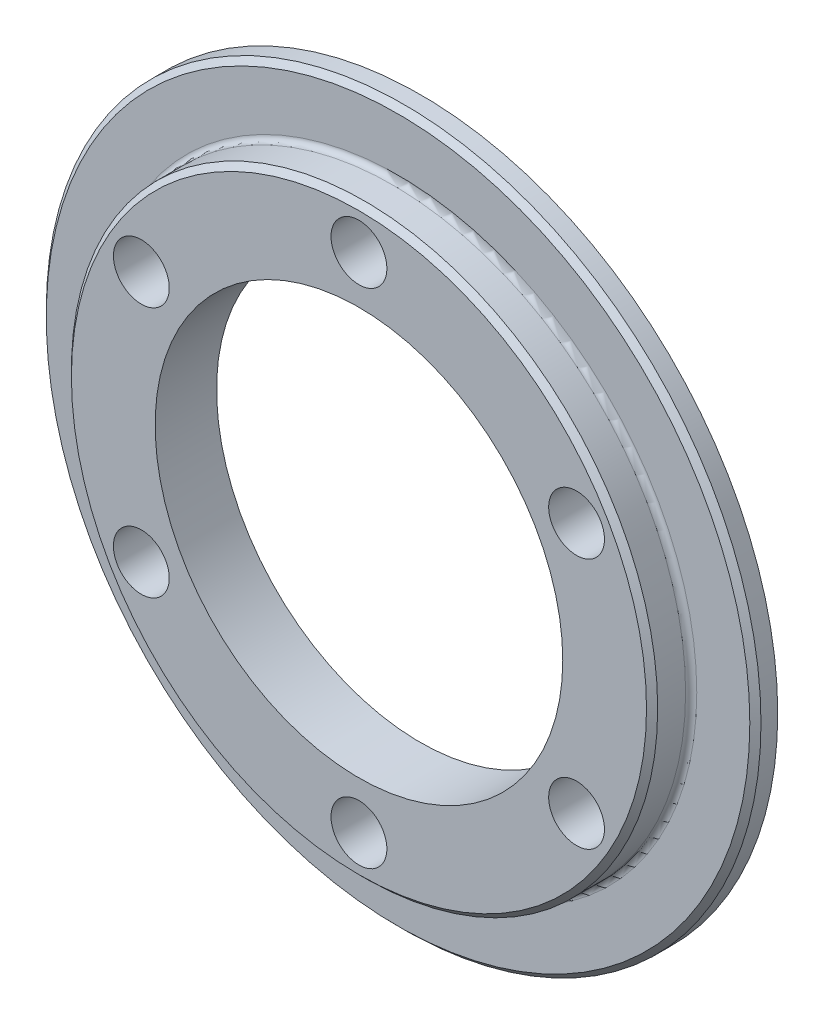
ISO-10303-21;
HEADER;
FILE_DESCRIPTION(('STEP AP214'),'2;1');
FILE_NAME('part.step','',(''),(''),'','','');
FILE_SCHEMA(('AUTOMOTIVE_DESIGN { 1 0 10303 214 1 1 1 1 }'));
ENDSEC;
DATA;
#1=APPLICATION_CONTEXT('core data for automotive mechanical design processes');
#2=APPLICATION_PROTOCOL_DEFINITION('international standard','automotive_design',2000,#1);
#3=PRODUCT_CONTEXT('',#1,'mechanical');
#4=PRODUCT('Part','Part','',(#3));
#5=PRODUCT_RELATED_PRODUCT_CATEGORY('part','',(#4));
#6=PRODUCT_DEFINITION_FORMATION('','',#4);
#7=PRODUCT_DEFINITION_CONTEXT('part definition',#1,'design');
#8=PRODUCT_DEFINITION('design','',#6,#7);
#9=PRODUCT_DEFINITION_SHAPE('','',#8);
#10=(LENGTH_UNIT() NAMED_UNIT(*) SI_UNIT(.MILLI.,.METRE.));
#11=(NAMED_UNIT(*) PLANE_ANGLE_UNIT() SI_UNIT($,.RADIAN.));
#12=(NAMED_UNIT(*) SI_UNIT($,.STERADIAN.) SOLID_ANGLE_UNIT());
#13=UNCERTAINTY_MEASURE_WITH_UNIT(LENGTH_MEASURE(1.E-05),#10,'distance_accuracy_value','');
#14=(GEOMETRIC_REPRESENTATION_CONTEXT(3) GLOBAL_UNCERTAINTY_ASSIGNED_CONTEXT((#13)) GLOBAL_UNIT_ASSIGNED_CONTEXT((#10,
#11,#12)) REPRESENTATION_CONTEXT('',''));
#15=CARTESIAN_POINT('',(0.,0.,0.));
#16=DIRECTION('',(0.,0.,1.));
#17=DIRECTION('',(1.,0.,0.));
#18=AXIS2_PLACEMENT_3D('',#15,#16,#17);
#19=CARTESIAN_POINT('',(0.,0.,11.));
#20=DIRECTION('',(0.,0.,1.));
#21=DIRECTION('',(1.,0.,0.));
#22=AXIS2_PLACEMENT_3D('',#19,#20,#21);
#23=PLANE('',#22);
#24=CARTESIAN_POINT('',(38.9711431702939,22.5000000000008,11.));
#25=DIRECTION('',(0.,0.,1.));
#26=DIRECTION('',(1.,0.,0.));
#27=AXIS2_PLACEMENT_3D('',#24,#25,#26);
#28=CIRCLE('',#27,4.99999999999839);
#29=CARTESIAN_POINT('',(33.9711431702955,22.5000000000008,11.));
#30=VERTEX_POINT('',#29);
#31=EDGE_CURVE('E105',#30,#30,#28,.T.);
#32=ORIENTED_EDGE('',*,*,#31,.F.);
#33=EDGE_LOOP('',(#32));
#34=FACE_BOUND('',#33,.T.);
#35=CARTESIAN_POINT('',(38.9711431702917,-22.4999999999937,11.));
#36=DIRECTION('',(0.,0.,1.));
#37=DIRECTION('',(1.,0.,0.));
#38=AXIS2_PLACEMENT_3D('',#35,#36,#37);
#39=CIRCLE('',#38,5.00000000000197);
#40=CARTESIAN_POINT('',(33.9711431702897,-22.4999999999937,11.));
#41=VERTEX_POINT('',#40);
#42=EDGE_CURVE('E96',#41,#41,#39,.T.);
#43=ORIENTED_EDGE('',*,*,#42,.F.);
#44=EDGE_LOOP('',(#43));
#45=FACE_BOUND('',#44,.T.);
#46=CARTESIAN_POINT('',(-4.40154306000749E-12,-44.999999999989,11.));
#47=DIRECTION('',(0.,0.,1.));
#48=DIRECTION('',(1.,0.,0.));
#49=AXIS2_PLACEMENT_3D('',#46,#47,#48);
#50=CIRCLE('',#49,5.00000000000772);
#51=CARTESIAN_POINT('',(-5.00000000001212,-44.999999999989,11.));
#52=VERTEX_POINT('',#51);
#53=EDGE_CURVE('E89',#52,#52,#50,.T.);
#54=ORIENTED_EDGE('',*,*,#53,.F.);
#55=EDGE_LOOP('',(#54));
#56=FACE_BOUND('',#55,.T.);
#57=CARTESIAN_POINT('',(-38.9711431702983,-22.4999999999898,11.));
#58=DIRECTION('',(0.,0.,1.));
#59=DIRECTION('',(1.,0.,0.));
#60=AXIS2_PLACEMENT_3D('',#57,#58,#59);
#61=CIRCLE('',#60,5.00000000000976);
#62=CARTESIAN_POINT('',(-43.971143170308,-22.4999999999898,11.));
#63=VERTEX_POINT('',#62);
#64=EDGE_CURVE('E85',#63,#63,#61,.T.);
#65=ORIENTED_EDGE('',*,*,#64,.F.);
#66=EDGE_LOOP('',(#65));
#67=FACE_BOUND('',#66,.T.);
#68=CARTESIAN_POINT('',(-38.9711431702961,22.5000000000047,11.));
#69=DIRECTION('',(0.,0.,1.));
#70=DIRECTION('',(1.,0.,0.));
#71=AXIS2_PLACEMENT_3D('',#68,#69,#70);
#72=CIRCLE('',#71,5.00000000000596);
#73=CARTESIAN_POINT('',(-43.971143170302,22.5000000000047,11.));
#74=VERTEX_POINT('',#73);
#75=EDGE_CURVE('E77',#74,#74,#72,.T.);
#76=ORIENTED_EDGE('',*,*,#75,.F.);
#77=EDGE_LOOP('',(#76));
#78=FACE_BOUND('',#77,.T.);
#79=CARTESIAN_POINT('',(0.,45.,11.));
#80=DIRECTION('',(0.,0.,1.));
#81=DIRECTION('',(1.,0.,0.));
#82=AXIS2_PLACEMENT_3D('',#79,#80,#81);
#83=CIRCLE('',#82,5.);
#84=CARTESIAN_POINT('',(-4.99999999999999,45.,11.));
#85=VERTEX_POINT('',#84);
#86=EDGE_CURVE('E67',#85,#85,#83,.T.);
#87=ORIENTED_EDGE('',*,*,#86,.F.);
#88=EDGE_LOOP('',(#87));
#89=FACE_BOUND('',#88,.T.);
#90=CARTESIAN_POINT('',(0.,0.,11.));
#91=DIRECTION('',(0.,0.,1.));
#92=DIRECTION('',(1.,0.,0.));
#93=AXIS2_PLACEMENT_3D('',#90,#91,#92);
#94=CIRCLE('',#93,51.5);
#95=CARTESIAN_POINT('',(51.5,0.,11.));
#96=VERTEX_POINT('',#95);
#97=EDGE_CURVE('E42',#96,#96,#94,.T.);
#98=ORIENTED_EDGE('',*,*,#97,.T.);
#99=EDGE_LOOP('',(#98));
#100=FACE_BOUND('',#99,.T.);
#101=CARTESIAN_POINT('',(0.,0.,11.));
#102=DIRECTION('',(0.,0.,1.));
#103=DIRECTION('',(1.,0.,0.));
#104=AXIS2_PLACEMENT_3D('',#101,#102,#103);
#105=CIRCLE('',#104,36.5);
#106=CARTESIAN_POINT('',(36.5,0.,11.));
#107=VERTEX_POINT('',#106);
#108=EDGE_CURVE('E68',#107,#107,#105,.T.);
#109=ORIENTED_EDGE('',*,*,#108,.F.);
#110=EDGE_LOOP('',(#109));
#111=FACE_BOUND('',#110,.T.);
#112=ADVANCED_FACE('F40',(#34,#45,#56,#67,#78,#89,#100,#111),#23,.T.);
#113=CARTESIAN_POINT('',(0.,0.,11.));
#114=DIRECTION('',(0.,0.,-1.));
#115=DIRECTION('',(-1.,0.,0.));
#116=AXIS2_PLACEMENT_3D('',#113,#114,#115);
#117=CYLINDRICAL_SURFACE('',#116,64.);
#118=CARTESIAN_POINT('',(0.,0.,3.00000000000005));
#119=DIRECTION('',(0.,0.,1.));
#120=DIRECTION('',(1.,0.,0.));
#121=AXIS2_PLACEMENT_3D('',#118,#119,#120);
#122=CIRCLE('',#121,64.);
#123=CARTESIAN_POINT('',(64.,0.,3.00000000000005));
#124=VERTEX_POINT('',#123);
#125=EDGE_CURVE('E48',#124,#124,#122,.F.);
#126=ORIENTED_EDGE('',*,*,#125,.T.);
#127=EDGE_LOOP('',(#126));
#128=FACE_BOUND('',#127,.T.);
#129=CARTESIAN_POINT('',(0.,0.,0.));
#130=DIRECTION('',(0.,0.,1.));
#131=DIRECTION('',(1.,0.,0.));
#132=AXIS2_PLACEMENT_3D('',#129,#130,#131);
#133=CIRCLE('',#132,64.);
#134=CARTESIAN_POINT('',(64.,0.,0.));
#135=VERTEX_POINT('',#134);
#136=EDGE_CURVE('E62',#135,#135,#133,.T.);
#137=ORIENTED_EDGE('',*,*,#136,.T.);
#138=EDGE_LOOP('',(#137));
#139=FACE_BOUND('',#138,.T.);
#140=ADVANCED_FACE('F113',(#128,#139),#117,.T.);
#141=CARTESIAN_POINT('',(0.,0.,0.));
#142=DIRECTION('',(0.,0.,1.));
#143=DIRECTION('',(1.,0.,0.));
#144=AXIS2_PLACEMENT_3D('',#141,#142,#143);
#145=PLANE('',#144);
#146=CARTESIAN_POINT('',(38.9711431702939,22.5000000000008,0.));
#147=DIRECTION('',(0.,0.,-1.));
#148=DIRECTION('',(-1.,0.,0.));
#149=AXIS2_PLACEMENT_3D('',#146,#147,#148);
#150=CIRCLE('',#149,4.99999999999839);
#151=CARTESIAN_POINT('',(33.9711431702955,22.5000000000008,0.));
#152=VERTEX_POINT('',#151);
#153=EDGE_CURVE('E104',#152,#152,#150,.T.);
#154=ORIENTED_EDGE('',*,*,#153,.F.);
#155=EDGE_LOOP('',(#154));
#156=FACE_BOUND('',#155,.T.);
#157=CARTESIAN_POINT('',(38.9711431702917,-22.4999999999937,0.));
#158=DIRECTION('',(0.,0.,-1.));
#159=DIRECTION('',(-1.,0.,0.));
#160=AXIS2_PLACEMENT_3D('',#157,#158,#159);
#161=CIRCLE('',#160,5.00000000000197);
#162=CARTESIAN_POINT('',(33.9711431702897,-22.4999999999937,0.));
#163=VERTEX_POINT('',#162);
#164=EDGE_CURVE('E97',#163,#163,#161,.T.);
#165=ORIENTED_EDGE('',*,*,#164,.F.);
#166=EDGE_LOOP('',(#165));
#167=FACE_BOUND('',#166,.T.);
#168=CARTESIAN_POINT('',(-4.40154306000749E-12,-44.999999999989,0.));
#169=DIRECTION('',(0.,0.,-1.));
#170=DIRECTION('',(-1.,0.,0.));
#171=AXIS2_PLACEMENT_3D('',#168,#169,#170);
#172=CIRCLE('',#171,5.00000000000772);
#173=CARTESIAN_POINT('',(-5.00000000001212,-44.999999999989,0.));
#174=VERTEX_POINT('',#173);
#175=EDGE_CURVE('E91',#174,#174,#172,.T.);
#176=ORIENTED_EDGE('',*,*,#175,.F.);
#177=EDGE_LOOP('',(#176));
#178=FACE_BOUND('',#177,.T.);
#179=CARTESIAN_POINT('',(-38.9711431702983,-22.4999999999898,0.));
#180=DIRECTION('',(0.,0.,-1.));
#181=DIRECTION('',(-1.,0.,0.));
#182=AXIS2_PLACEMENT_3D('',#179,#180,#181);
#183=CIRCLE('',#182,5.00000000000976);
#184=CARTESIAN_POINT('',(-43.971143170308,-22.4999999999898,0.));
#185=VERTEX_POINT('',#184);
#186=EDGE_CURVE('E87',#185,#185,#183,.T.);
#187=ORIENTED_EDGE('',*,*,#186,.F.);
#188=EDGE_LOOP('',(#187));
#189=FACE_BOUND('',#188,.T.);
#190=CARTESIAN_POINT('',(-38.9711431702961,22.5000000000047,0.));
#191=DIRECTION('',(0.,0.,-1.));
#192=DIRECTION('',(-1.,0.,0.));
#193=AXIS2_PLACEMENT_3D('',#190,#191,#192);
#194=CIRCLE('',#193,5.00000000000596);
#195=CARTESIAN_POINT('',(-43.971143170302,22.5000000000047,0.));
#196=VERTEX_POINT('',#195);
#197=EDGE_CURVE('E83',#196,#196,#194,.T.);
#198=ORIENTED_EDGE('',*,*,#197,.F.);
#199=EDGE_LOOP('',(#198));
#200=FACE_BOUND('',#199,.T.);
#201=CARTESIAN_POINT('',(0.,45.,0.));
#202=DIRECTION('',(0.,0.,-1.));
#203=DIRECTION('',(-1.,0.,0.));
#204=AXIS2_PLACEMENT_3D('',#201,#202,#203);
#205=CIRCLE('',#204,5.);
#206=CARTESIAN_POINT('',(-4.99999999999999,45.,0.));
#207=VERTEX_POINT('',#206);
#208=EDGE_CURVE('E73',#207,#207,#205,.T.);
#209=ORIENTED_EDGE('',*,*,#208,.F.);
#210=EDGE_LOOP('',(#209));
#211=FACE_BOUND('',#210,.T.);
#212=ORIENTED_EDGE('',*,*,#136,.F.);
#213=EDGE_LOOP('',(#212));
#214=FACE_BOUND('',#213,.T.);
#215=CARTESIAN_POINT('',(0.,0.,0.));
#216=DIRECTION('',(0.,0.,1.));
#217=DIRECTION('',(1.,0.,0.));
#218=AXIS2_PLACEMENT_3D('',#215,#216,#217);
#219=CIRCLE('',#218,36.5);
#220=CARTESIAN_POINT('',(36.5,0.,0.));
#221=VERTEX_POINT('',#220);
#222=EDGE_CURVE('E70',#221,#221,#219,.T.);
#223=ORIENTED_EDGE('',*,*,#222,.T.);
#224=EDGE_LOOP('',(#223));
#225=FACE_BOUND('',#224,.T.);
#226=ADVANCED_FACE('F112',(#156,#167,#178,#189,#200,#211,#214,#225),#145,.F.);
#227=CARTESIAN_POINT('',(0.,0.,11.));
#228=DIRECTION('',(0.,0.,-1.));
#229=DIRECTION('',(-1.,0.,0.));
#230=AXIS2_PLACEMENT_3D('',#227,#228,#229);
#231=CYLINDRICAL_SURFACE('',#230,36.5);
#232=ORIENTED_EDGE('',*,*,#108,.T.);
#233=EDGE_LOOP('',(#232));
#234=FACE_BOUND('',#233,.T.);
#235=ORIENTED_EDGE('',*,*,#222,.F.);
#236=EDGE_LOOP('',(#235));
#237=FACE_BOUND('',#236,.T.);
#238=ADVANCED_FACE('F111',(#234,#237),#231,.F.);
#239=CARTESIAN_POINT('',(0.,0.,4.));
#240=DIRECTION('',(0.,0.,1.));
#241=DIRECTION('',(1.,0.,0.));
#242=AXIS2_PLACEMENT_3D('',#239,#240,#241);
#243=PLANE('',#242);
#244=CARTESIAN_POINT('',(0.,0.,4.));
#245=DIRECTION('',(0.,0.,1.));
#246=DIRECTION('',(1.,0.,0.));
#247=AXIS2_PLACEMENT_3D('',#244,#245,#246);
#248=CIRCLE('',#247,63.0000000000001);
#249=CARTESIAN_POINT('',(63.0000000000001,0.,4.));
#250=VERTEX_POINT('',#249);
#251=EDGE_CURVE('E55',#250,#250,#248,.T.);
#252=ORIENTED_EDGE('',*,*,#251,.T.);
#253=EDGE_LOOP('',(#252));
#254=FACE_BOUND('',#253,.T.);
#255=CARTESIAN_POINT('',(0.,0.,4.));
#256=DIRECTION('',(0.,0.,1.));
#257=DIRECTION('',(1.,0.,0.));
#258=AXIS2_PLACEMENT_3D('',#255,#256,#257);
#259=CIRCLE('',#258,53.5);
#260=CARTESIAN_POINT('',(53.5,0.,4.));
#261=VERTEX_POINT('',#260);
#262=EDGE_CURVE('E60',#261,#261,#259,.F.);
#263=ORIENTED_EDGE('',*,*,#262,.T.);
#264=EDGE_LOOP('',(#263));
#265=FACE_BOUND('',#264,.T.);
#266=ADVANCED_FACE('F135',(#254,#265),#243,.T.);
#267=CARTESIAN_POINT('',(0.,0.,4.));
#268=DIRECTION('',(0.,0.,1.));
#269=DIRECTION('',(1.,0.,0.));
#270=AXIS2_PLACEMENT_3D('',#267,#268,#269);
#271=CYLINDRICAL_SURFACE('',#270,52.5);
#272=CARTESIAN_POINT('',(0.,0.,9.99999999999998));
#273=DIRECTION('',(0.,0.,1.));
#274=DIRECTION('',(1.,0.,0.));
#275=AXIS2_PLACEMENT_3D('',#272,#273,#274);
#276=CIRCLE('',#275,52.5);
#277=CARTESIAN_POINT('',(52.5,0.,9.99999999999998));
#278=VERTEX_POINT('',#277);
#279=EDGE_CURVE('E10',#278,#278,#276,.F.);
#280=ORIENTED_EDGE('',*,*,#279,.T.);
#281=EDGE_LOOP('',(#280));
#282=FACE_BOUND('',#281,.T.);
#283=CARTESIAN_POINT('',(0.,0.,5.));
#284=DIRECTION('',(0.,0.,1.));
#285=DIRECTION('',(1.,0.,0.));
#286=AXIS2_PLACEMENT_3D('',#283,#284,#285);
#287=CIRCLE('',#286,52.5);
#288=CARTESIAN_POINT('',(52.5,0.,5.));
#289=VERTEX_POINT('',#288);
#290=EDGE_CURVE('E58',#289,#289,#287,.T.);
#291=ORIENTED_EDGE('',*,*,#290,.T.);
#292=EDGE_LOOP('',(#291));
#293=FACE_BOUND('',#292,.T.);
#294=ADVANCED_FACE('F140',(#282,#293),#271,.T.);
#295=CARTESIAN_POINT('',(0.,0.,5.));
#296=DIRECTION('',(0.,0.,1.));
#297=DIRECTION('',(1.,0.,0.));
#298=AXIS2_PLACEMENT_3D('',#295,#296,#297);
#299=TOROIDAL_SURFACE('',#298,53.5,1.);
#300=ORIENTED_EDGE('',*,*,#262,.F.);
#301=EDGE_LOOP('',(#300));
#302=FACE_BOUND('',#301,.T.);
#303=ORIENTED_EDGE('',*,*,#290,.F.);
#304=EDGE_LOOP('',(#303));
#305=FACE_BOUND('',#304,.T.);
#306=ADVANCED_FACE('F152',(#302,#305),#299,.F.);
#307=CARTESIAN_POINT('',(0.,0.,4.));
#308=DIRECTION('',(0.,0.,-1.));
#309=DIRECTION('',(-1.,0.,0.));
#310=AXIS2_PLACEMENT_3D('',#307,#308,#309);
#311=CONICAL_SURFACE('',#310,63.0000000000001,0.785398163397449);
#312=ORIENTED_EDGE('',*,*,#125,.F.);
#313=EDGE_LOOP('',(#312));
#314=FACE_BOUND('',#313,.T.);
#315=ORIENTED_EDGE('',*,*,#251,.F.);
#316=EDGE_LOOP('',(#315));
#317=FACE_BOUND('',#316,.T.);
#318=ADVANCED_FACE('F154',(#314,#317),#311,.T.);
#319=CARTESIAN_POINT('',(0.,0.,11.));
#320=DIRECTION('',(0.,0.,-1.));
#321=DIRECTION('',(-1.,0.,0.));
#322=AXIS2_PLACEMENT_3D('',#319,#320,#321);
#323=CONICAL_SURFACE('',#322,51.5,0.785398163397441);
#324=ORIENTED_EDGE('',*,*,#279,.F.);
#325=EDGE_LOOP('',(#324));
#326=FACE_BOUND('',#325,.T.);
#327=ORIENTED_EDGE('',*,*,#97,.F.);
#328=EDGE_LOOP('',(#327));
#329=FACE_BOUND('',#328,.T.);
#330=ADVANCED_FACE('F39',(#326,#329),#323,.T.);
#331=CARTESIAN_POINT('',(0.,45.,60.));
#332=DIRECTION('',(0.,0.,-1.));
#333=DIRECTION('',(-1.,0.,0.));
#334=AXIS2_PLACEMENT_3D('',#331,#332,#333);
#335=CYLINDRICAL_SURFACE('',#334,5.);
#336=CARTESIAN_POINT('',(-4.99999999999999,45.,11.));
#337=CARTESIAN_POINT('',(-4.99999999999999,45.,10.8854166666667));
#338=CARTESIAN_POINT('',(-4.99999999999999,45.,10.7708333333333));
#339=CARTESIAN_POINT('',(-4.99999999999999,45.,10.5416666666667));
#340=CARTESIAN_POINT('',(-4.99999999999999,45.,10.4270833333333));
#341=CARTESIAN_POINT('',(-4.99999999999999,45.,10.1979166666667));
#342=CARTESIAN_POINT('',(-4.99999999999999,45.,10.0833333333333));
#343=CARTESIAN_POINT('',(-4.99999999999999,45.,9.85416666666666));
#344=CARTESIAN_POINT('',(-4.99999999999999,45.,9.73958333333333));
#345=CARTESIAN_POINT('',(-4.99999999999999,45.,9.51041666666666));
#346=CARTESIAN_POINT('',(-4.99999999999999,45.,9.39583333333333));
#347=CARTESIAN_POINT('',(-4.99999999999999,45.,9.16666666666666));
#348=CARTESIAN_POINT('',(-4.99999999999999,45.,9.05208333333333));
#349=CARTESIAN_POINT('',(-4.99999999999999,45.,8.82291666666666));
#350=CARTESIAN_POINT('',(-4.99999999999999,45.,8.70833333333333));
#351=CARTESIAN_POINT('',(-4.99999999999999,45.,8.47916666666666));
#352=CARTESIAN_POINT('',(-4.99999999999999,45.,8.36458333333333));
#353=CARTESIAN_POINT('',(-4.99999999999999,45.,8.13541666666666));
#354=CARTESIAN_POINT('',(-4.99999999999999,45.,8.02083333333333));
#355=CARTESIAN_POINT('',(-4.99999999999999,45.,7.79166666666666));
#356=CARTESIAN_POINT('',(-4.99999999999999,45.,7.67708333333333));
#357=CARTESIAN_POINT('',(-4.99999999999999,45.,7.44791666666667));
#358=CARTESIAN_POINT('',(-4.99999999999999,45.,7.33333333333333));
#359=CARTESIAN_POINT('',(-4.99999999999999,45.,7.10416666666666));
#360=CARTESIAN_POINT('',(-4.99999999999999,45.,6.98958333333333));
#361=CARTESIAN_POINT('',(-4.99999999999999,45.,6.76041666666666));
#362=CARTESIAN_POINT('',(-4.99999999999999,45.,6.64583333333333));
#363=CARTESIAN_POINT('',(-4.99999999999999,45.,6.41666666666666));
#364=CARTESIAN_POINT('',(-4.99999999999999,45.,6.30208333333333));
#365=CARTESIAN_POINT('',(-4.99999999999999,45.,6.07291666666666));
#366=CARTESIAN_POINT('',(-4.99999999999999,45.,5.95833333333333));
#367=CARTESIAN_POINT('',(-4.99999999999999,45.,5.72916666666666));
#368=CARTESIAN_POINT('',(-4.99999999999999,45.,5.61458333333333));
#369=CARTESIAN_POINT('',(-4.99999999999999,45.,5.38541666666667));
#370=CARTESIAN_POINT('',(-4.99999999999999,45.,5.27083333333333));
#371=CARTESIAN_POINT('',(-4.99999999999999,45.,5.04166666666667));
#372=CARTESIAN_POINT('',(-4.99999999999999,45.,4.92708333333333));
#373=CARTESIAN_POINT('',(-4.99999999999999,45.,4.69791666666667));
#374=CARTESIAN_POINT('',(-4.99999999999999,45.,4.58333333333333));
#375=CARTESIAN_POINT('',(-4.99999999999999,45.,4.35416666666667));
#376=CARTESIAN_POINT('',(-4.99999999999999,45.,4.23958333333333));
#377=CARTESIAN_POINT('',(-4.99999999999999,45.,4.01041666666666));
#378=CARTESIAN_POINT('',(-4.99999999999999,45.,3.89583333333333));
#379=CARTESIAN_POINT('',(-4.99999999999999,45.,3.66666666666667));
#380=CARTESIAN_POINT('',(-4.99999999999999,45.,3.55208333333333));
#381=CARTESIAN_POINT('',(-4.99999999999999,45.,3.32291666666666));
#382=CARTESIAN_POINT('',(-4.99999999999999,45.,3.20833333333333));
#383=CARTESIAN_POINT('',(-4.99999999999999,45.,2.97916666666667));
#384=CARTESIAN_POINT('',(-4.99999999999999,45.,2.86458333333333));
#385=CARTESIAN_POINT('',(-4.99999999999999,45.,2.63541666666667));
#386=CARTESIAN_POINT('',(-4.99999999999999,45.,2.52083333333333));
#387=CARTESIAN_POINT('',(-4.99999999999999,45.,2.29166666666666));
#388=CARTESIAN_POINT('',(-4.99999999999999,45.,2.17708333333333));
#389=CARTESIAN_POINT('',(-4.99999999999999,45.,1.94791666666666));
#390=CARTESIAN_POINT('',(-4.99999999999999,45.,1.83333333333333));
#391=CARTESIAN_POINT('',(-4.99999999999999,45.,1.60416666666667));
#392=CARTESIAN_POINT('',(-4.99999999999999,45.,1.48958333333333));
#393=CARTESIAN_POINT('',(-4.99999999999999,45.,1.26041666666667));
#394=CARTESIAN_POINT('',(-4.99999999999999,45.,1.14583333333333));
#395=CARTESIAN_POINT('',(-4.99999999999999,45.,0.916666666666665));
#396=CARTESIAN_POINT('',(-4.99999999999999,45.,0.802083333333333));
#397=CARTESIAN_POINT('',(-4.99999999999999,45.,0.572916666666668));
#398=CARTESIAN_POINT('',(-4.99999999999999,45.,0.458333333333336));
#399=CARTESIAN_POINT('',(-4.99999999999999,45.,0.229166666666669));
#400=CARTESIAN_POINT('',(-4.99999999999999,45.,0.114583333333335));
#401=CARTESIAN_POINT('',(-4.99999999999999,45.,0.));
#402=B_SPLINE_CURVE_WITH_KNOTS('',3,(#336,#337,#338,#339,#340,#341,#342,#343,#344,#345,#346,
#347,#348,#349,#350,#351,#352,#353,#354,#355,#356,#357,#358,#359,#360,#361,#362,#363,#364,#365,
#366,#367,#368,#369,#370,#371,#372,#373,#374,#375,#376,#377,#378,#379,#380,#381,#382,#383,#384,
#385,#386,#387,#388,#389,#390,#391,#392,#393,#394,#395,#396,#397,#398,#399,#400,#401),
.UNSPECIFIED.,.F.,.F.,(4,2,2,2,2,2,2,2,2,2,2,2,2,2,2,2,2,2,2,2,2,2,2,2,2,2,2,2,2,2,2,2,4),(0.,
0.343749999999997,0.687500000000001,1.03125,1.375,1.71875,2.0625,2.40625,2.75,3.09375,3.4375,
3.78125,4.125,4.46875,4.8125,5.15625,5.5,5.84374999999999,6.1875,6.53125,6.875,7.21875,7.5625,
7.90625,8.24999999999999,8.59375,8.9375,9.28125,9.62499999999999,9.96875,10.3125,10.65625,11.),.UNSPECIFIED.);
#403=EDGE_CURVE('BSEAM165',#85,#207,#402,.T.);
#404=ORIENTED_EDGE('',*,*,#86,.T.);
#405=ORIENTED_EDGE('',*,*,#208,.T.);
#406=ORIENTED_EDGE('',*,*,#403,.T.);
#407=ORIENTED_EDGE('',*,*,#403,.F.);
#408=EDGE_LOOP('',(#404,#406,#405,#407));
#409=FACE_BOUND('',#408,.T.);
#410=ADVANCED_FACE('F165',(#409),#335,.F.);
#411=CARTESIAN_POINT('',(-38.9711431702961,22.5000000000047,60.));
#412=DIRECTION('',(0.,0.,-1.));
#413=DIRECTION('',(-1.,0.,0.));
#414=AXIS2_PLACEMENT_3D('',#411,#412,#413);
#415=CYLINDRICAL_SURFACE('',#414,5.00000000000596);
#416=CARTESIAN_POINT('',(-43.971143170302,22.5000000000047,11.));
#417=CARTESIAN_POINT('',(-43.971143170302,22.5000000000047,10.8854166666667));
#418=CARTESIAN_POINT('',(-43.971143170302,22.5000000000047,10.7708333333333));
#419=CARTESIAN_POINT('',(-43.971143170302,22.5000000000047,10.5416666666667));
#420=CARTESIAN_POINT('',(-43.971143170302,22.5000000000047,10.4270833333333));
#421=CARTESIAN_POINT('',(-43.971143170302,22.5000000000047,10.1979166666667));
#422=CARTESIAN_POINT('',(-43.971143170302,22.5000000000047,10.0833333333333));
#423=CARTESIAN_POINT('',(-43.971143170302,22.5000000000047,9.85416666666666));
#424=CARTESIAN_POINT('',(-43.971143170302,22.5000000000047,9.73958333333333));
#425=CARTESIAN_POINT('',(-43.971143170302,22.5000000000047,9.51041666666666));
#426=CARTESIAN_POINT('',(-43.971143170302,22.5000000000047,9.39583333333333));
#427=CARTESIAN_POINT('',(-43.971143170302,22.5000000000047,9.16666666666666));
#428=CARTESIAN_POINT('',(-43.971143170302,22.5000000000047,9.05208333333333));
#429=CARTESIAN_POINT('',(-43.971143170302,22.5000000000047,8.82291666666666));
#430=CARTESIAN_POINT('',(-43.971143170302,22.5000000000047,8.70833333333333));
#431=CARTESIAN_POINT('',(-43.971143170302,22.5000000000047,8.47916666666666));
#432=CARTESIAN_POINT('',(-43.971143170302,22.5000000000047,8.36458333333333));
#433=CARTESIAN_POINT('',(-43.971143170302,22.5000000000047,8.13541666666666));
#434=CARTESIAN_POINT('',(-43.971143170302,22.5000000000047,8.02083333333333));
#435=CARTESIAN_POINT('',(-43.971143170302,22.5000000000047,7.79166666666666));
#436=CARTESIAN_POINT('',(-43.971143170302,22.5000000000047,7.67708333333333));
#437=CARTESIAN_POINT('',(-43.971143170302,22.5000000000047,7.44791666666667));
#438=CARTESIAN_POINT('',(-43.971143170302,22.5000000000047,7.33333333333333));
#439=CARTESIAN_POINT('',(-43.971143170302,22.5000000000047,7.10416666666666));
#440=CARTESIAN_POINT('',(-43.971143170302,22.5000000000047,6.98958333333333));
#441=CARTESIAN_POINT('',(-43.971143170302,22.5000000000047,6.76041666666666));
#442=CARTESIAN_POINT('',(-43.971143170302,22.5000000000047,6.64583333333333));
#443=CARTESIAN_POINT('',(-43.971143170302,22.5000000000047,6.41666666666666));
#444=CARTESIAN_POINT('',(-43.971143170302,22.5000000000047,6.30208333333333));
#445=CARTESIAN_POINT('',(-43.971143170302,22.5000000000047,6.07291666666666));
#446=CARTESIAN_POINT('',(-43.971143170302,22.5000000000047,5.95833333333333));
#447=CARTESIAN_POINT('',(-43.971143170302,22.5000000000047,5.72916666666666));
#448=CARTESIAN_POINT('',(-43.971143170302,22.5000000000047,5.61458333333333));
#449=CARTESIAN_POINT('',(-43.971143170302,22.5000000000047,5.38541666666667));
#450=CARTESIAN_POINT('',(-43.971143170302,22.5000000000047,5.27083333333333));
#451=CARTESIAN_POINT('',(-43.971143170302,22.5000000000047,5.04166666666667));
#452=CARTESIAN_POINT('',(-43.971143170302,22.5000000000047,4.92708333333333));
#453=CARTESIAN_POINT('',(-43.971143170302,22.5000000000047,4.69791666666667));
#454=CARTESIAN_POINT('',(-43.971143170302,22.5000000000047,4.58333333333333));
#455=CARTESIAN_POINT('',(-43.971143170302,22.5000000000047,4.35416666666667));
#456=CARTESIAN_POINT('',(-43.971143170302,22.5000000000047,4.23958333333333));
#457=CARTESIAN_POINT('',(-43.971143170302,22.5000000000047,4.01041666666666));
#458=CARTESIAN_POINT('',(-43.971143170302,22.5000000000047,3.89583333333333));
#459=CARTESIAN_POINT('',(-43.971143170302,22.5000000000047,3.66666666666667));
#460=CARTESIAN_POINT('',(-43.971143170302,22.5000000000047,3.55208333333333));
#461=CARTESIAN_POINT('',(-43.971143170302,22.5000000000047,3.32291666666666));
#462=CARTESIAN_POINT('',(-43.971143170302,22.5000000000047,3.20833333333333));
#463=CARTESIAN_POINT('',(-43.971143170302,22.5000000000047,2.97916666666667));
#464=CARTESIAN_POINT('',(-43.971143170302,22.5000000000047,2.86458333333333));
#465=CARTESIAN_POINT('',(-43.971143170302,22.5000000000047,2.63541666666667));
#466=CARTESIAN_POINT('',(-43.971143170302,22.5000000000047,2.52083333333333));
#467=CARTESIAN_POINT('',(-43.971143170302,22.5000000000047,2.29166666666666));
#468=CARTESIAN_POINT('',(-43.971143170302,22.5000000000047,2.17708333333333));
#469=CARTESIAN_POINT('',(-43.971143170302,22.5000000000047,1.94791666666666));
#470=CARTESIAN_POINT('',(-43.971143170302,22.5000000000047,1.83333333333333));
#471=CARTESIAN_POINT('',(-43.971143170302,22.5000000000047,1.60416666666667));
#472=CARTESIAN_POINT('',(-43.971143170302,22.5000000000047,1.48958333333333));
#473=CARTESIAN_POINT('',(-43.971143170302,22.5000000000047,1.26041666666667));
#474=CARTESIAN_POINT('',(-43.971143170302,22.5000000000047,1.14583333333333));
#475=CARTESIAN_POINT('',(-43.971143170302,22.5000000000047,0.916666666666665));
#476=CARTESIAN_POINT('',(-43.971143170302,22.5000000000047,0.802083333333333));
#477=CARTESIAN_POINT('',(-43.971143170302,22.5000000000047,0.572916666666668));
#478=CARTESIAN_POINT('',(-43.971143170302,22.5000000000047,0.458333333333336));
#479=CARTESIAN_POINT('',(-43.971143170302,22.5000000000047,0.229166666666669));
#480=CARTESIAN_POINT('',(-43.971143170302,22.5000000000047,0.114583333333335));
#481=CARTESIAN_POINT('',(-43.971143170302,22.5000000000047,0.));
#482=B_SPLINE_CURVE_WITH_KNOTS('',3,(#416,#417,#418,#419,#420,#421,#422,#423,#424,#425,#426,
#427,#428,#429,#430,#431,#432,#433,#434,#435,#436,#437,#438,#439,#440,#441,#442,#443,#444,#445,
#446,#447,#448,#449,#450,#451,#452,#453,#454,#455,#456,#457,#458,#459,#460,#461,#462,#463,#464,
#465,#466,#467,#468,#469,#470,#471,#472,#473,#474,#475,#476,#477,#478,#479,#480,#481),
.UNSPECIFIED.,.F.,.F.,(4,2,2,2,2,2,2,2,2,2,2,2,2,2,2,2,2,2,2,2,2,2,2,2,2,2,2,2,2,2,2,2,4),(0.,
0.343749999999997,0.687500000000001,1.03125,1.375,1.71875,2.0625,2.40625,2.75,3.09375,3.4375,
3.78125,4.125,4.46875,4.8125,5.15625,5.5,5.84374999999999,6.1875,6.53125,6.875,7.21875,7.5625,
7.90625,8.24999999999999,8.59375,8.9375,9.28125,9.62499999999999,9.96875,10.3125,10.65625,11.),.UNSPECIFIED.);
#483=EDGE_CURVE('BSEAM176',#74,#196,#482,.T.);
#484=ORIENTED_EDGE('',*,*,#75,.T.);
#485=ORIENTED_EDGE('',*,*,#197,.T.);
#486=ORIENTED_EDGE('',*,*,#483,.T.);
#487=ORIENTED_EDGE('',*,*,#483,.F.);
#488=EDGE_LOOP('',(#484,#486,#485,#487));
#489=FACE_BOUND('',#488,.T.);
#490=ADVANCED_FACE('F176',(#489),#415,.F.);
#491=CARTESIAN_POINT('',(-38.9711431702983,-22.4999999999898,60.));
#492=DIRECTION('',(0.,0.,-1.));
#493=DIRECTION('',(-1.,0.,0.));
#494=AXIS2_PLACEMENT_3D('',#491,#492,#493);
#495=CYLINDRICAL_SURFACE('',#494,5.00000000000976);
#496=CARTESIAN_POINT('',(-43.971143170308,-22.4999999999898,11.));
#497=CARTESIAN_POINT('',(-43.971143170308,-22.4999999999898,10.8854166666667));
#498=CARTESIAN_POINT('',(-43.971143170308,-22.4999999999898,10.7708333333333));
#499=CARTESIAN_POINT('',(-43.971143170308,-22.4999999999898,10.5416666666667));
#500=CARTESIAN_POINT('',(-43.971143170308,-22.4999999999898,10.4270833333333));
#501=CARTESIAN_POINT('',(-43.971143170308,-22.4999999999898,10.1979166666667));
#502=CARTESIAN_POINT('',(-43.971143170308,-22.4999999999898,10.0833333333333));
#503=CARTESIAN_POINT('',(-43.971143170308,-22.4999999999898,9.85416666666666));
#504=CARTESIAN_POINT('',(-43.971143170308,-22.4999999999898,9.73958333333333));
#505=CARTESIAN_POINT('',(-43.971143170308,-22.4999999999898,9.51041666666666));
#506=CARTESIAN_POINT('',(-43.971143170308,-22.4999999999898,9.39583333333333));
#507=CARTESIAN_POINT('',(-43.971143170308,-22.4999999999898,9.16666666666666));
#508=CARTESIAN_POINT('',(-43.971143170308,-22.4999999999898,9.05208333333333));
#509=CARTESIAN_POINT('',(-43.971143170308,-22.4999999999898,8.82291666666666));
#510=CARTESIAN_POINT('',(-43.971143170308,-22.4999999999898,8.70833333333333));
#511=CARTESIAN_POINT('',(-43.971143170308,-22.4999999999898,8.47916666666666));
#512=CARTESIAN_POINT('',(-43.971143170308,-22.4999999999898,8.36458333333333));
#513=CARTESIAN_POINT('',(-43.971143170308,-22.4999999999898,8.13541666666666));
#514=CARTESIAN_POINT('',(-43.971143170308,-22.4999999999898,8.02083333333333));
#515=CARTESIAN_POINT('',(-43.971143170308,-22.4999999999898,7.79166666666666));
#516=CARTESIAN_POINT('',(-43.971143170308,-22.4999999999898,7.67708333333333));
#517=CARTESIAN_POINT('',(-43.971143170308,-22.4999999999898,7.44791666666667));
#518=CARTESIAN_POINT('',(-43.971143170308,-22.4999999999898,7.33333333333333));
#519=CARTESIAN_POINT('',(-43.971143170308,-22.4999999999898,7.10416666666666));
#520=CARTESIAN_POINT('',(-43.971143170308,-22.4999999999898,6.98958333333333));
#521=CARTESIAN_POINT('',(-43.971143170308,-22.4999999999898,6.76041666666666));
#522=CARTESIAN_POINT('',(-43.971143170308,-22.4999999999898,6.64583333333333));
#523=CARTESIAN_POINT('',(-43.971143170308,-22.4999999999898,6.41666666666666));
#524=CARTESIAN_POINT('',(-43.971143170308,-22.4999999999898,6.30208333333333));
#525=CARTESIAN_POINT('',(-43.971143170308,-22.4999999999898,6.07291666666666));
#526=CARTESIAN_POINT('',(-43.971143170308,-22.4999999999898,5.95833333333333));
#527=CARTESIAN_POINT('',(-43.971143170308,-22.4999999999898,5.72916666666666));
#528=CARTESIAN_POINT('',(-43.971143170308,-22.4999999999898,5.61458333333333));
#529=CARTESIAN_POINT('',(-43.971143170308,-22.4999999999898,5.38541666666667));
#530=CARTESIAN_POINT('',(-43.971143170308,-22.4999999999898,5.27083333333333));
#531=CARTESIAN_POINT('',(-43.971143170308,-22.4999999999898,5.04166666666667));
#532=CARTESIAN_POINT('',(-43.971143170308,-22.4999999999898,4.92708333333333));
#533=CARTESIAN_POINT('',(-43.971143170308,-22.4999999999898,4.69791666666667));
#534=CARTESIAN_POINT('',(-43.971143170308,-22.4999999999898,4.58333333333333));
#535=CARTESIAN_POINT('',(-43.971143170308,-22.4999999999898,4.35416666666667));
#536=CARTESIAN_POINT('',(-43.971143170308,-22.4999999999898,4.23958333333333));
#537=CARTESIAN_POINT('',(-43.971143170308,-22.4999999999898,4.01041666666666));
#538=CARTESIAN_POINT('',(-43.971143170308,-22.4999999999898,3.89583333333333));
#539=CARTESIAN_POINT('',(-43.971143170308,-22.4999999999898,3.66666666666667));
#540=CARTESIAN_POINT('',(-43.971143170308,-22.4999999999898,3.55208333333333));
#541=CARTESIAN_POINT('',(-43.971143170308,-22.4999999999898,3.32291666666666));
#542=CARTESIAN_POINT('',(-43.971143170308,-22.4999999999898,3.20833333333333));
#543=CARTESIAN_POINT('',(-43.971143170308,-22.4999999999898,2.97916666666667));
#544=CARTESIAN_POINT('',(-43.971143170308,-22.4999999999898,2.86458333333333));
#545=CARTESIAN_POINT('',(-43.971143170308,-22.4999999999898,2.63541666666667));
#546=CARTESIAN_POINT('',(-43.971143170308,-22.4999999999898,2.52083333333333));
#547=CARTESIAN_POINT('',(-43.971143170308,-22.4999999999898,2.29166666666666));
#548=CARTESIAN_POINT('',(-43.971143170308,-22.4999999999898,2.17708333333333));
#549=CARTESIAN_POINT('',(-43.971143170308,-22.4999999999898,1.94791666666666));
#550=CARTESIAN_POINT('',(-43.971143170308,-22.4999999999898,1.83333333333333));
#551=CARTESIAN_POINT('',(-43.971143170308,-22.4999999999898,1.60416666666667));
#552=CARTESIAN_POINT('',(-43.971143170308,-22.4999999999898,1.48958333333333));
#553=CARTESIAN_POINT('',(-43.971143170308,-22.4999999999898,1.26041666666667));
#554=CARTESIAN_POINT('',(-43.971143170308,-22.4999999999898,1.14583333333333));
#555=CARTESIAN_POINT('',(-43.971143170308,-22.4999999999898,0.916666666666665));
#556=CARTESIAN_POINT('',(-43.971143170308,-22.4999999999898,0.802083333333333));
#557=CARTESIAN_POINT('',(-43.971143170308,-22.4999999999898,0.572916666666668));
#558=CARTESIAN_POINT('',(-43.971143170308,-22.4999999999898,0.458333333333336));
#559=CARTESIAN_POINT('',(-43.971143170308,-22.4999999999898,0.229166666666669));
#560=CARTESIAN_POINT('',(-43.971143170308,-22.4999999999898,0.114583333333335));
#561=CARTESIAN_POINT('',(-43.971143170308,-22.4999999999898,0.));
#562=B_SPLINE_CURVE_WITH_KNOTS('',3,(#496,#497,#498,#499,#500,#501,#502,#503,#504,#505,#506,
#507,#508,#509,#510,#511,#512,#513,#514,#515,#516,#517,#518,#519,#520,#521,#522,#523,#524,#525,
#526,#527,#528,#529,#530,#531,#532,#533,#534,#535,#536,#537,#538,#539,#540,#541,#542,#543,#544,
#545,#546,#547,#548,#549,#550,#551,#552,#553,#554,#555,#556,#557,#558,#559,#560,#561),
.UNSPECIFIED.,.F.,.F.,(4,2,2,2,2,2,2,2,2,2,2,2,2,2,2,2,2,2,2,2,2,2,2,2,2,2,2,2,2,2,2,2,4),(0.,
0.343749999999997,0.687500000000001,1.03125,1.375,1.71875,2.0625,2.40625,2.75,3.09375,3.4375,
3.78125,4.125,4.46875,4.8125,5.15625,5.5,5.84374999999999,6.1875,6.53125,6.875,7.21875,7.5625,
7.90625,8.24999999999999,8.59375,8.9375,9.28125,9.62499999999999,9.96875,10.3125,10.65625,11.),.UNSPECIFIED.);
#563=EDGE_CURVE('BSEAM185',#63,#185,#562,.T.);
#564=ORIENTED_EDGE('',*,*,#64,.T.);
#565=ORIENTED_EDGE('',*,*,#186,.T.);
#566=ORIENTED_EDGE('',*,*,#563,.T.);
#567=ORIENTED_EDGE('',*,*,#563,.F.);
#568=EDGE_LOOP('',(#564,#566,#565,#567));
#569=FACE_BOUND('',#568,.T.);
#570=ADVANCED_FACE('F185',(#569),#495,.F.);
#571=CARTESIAN_POINT('',(-4.40154306000749E-12,-44.999999999989,60.));
#572=DIRECTION('',(0.,0.,-1.));
#573=DIRECTION('',(-1.,0.,0.));
#574=AXIS2_PLACEMENT_3D('',#571,#572,#573);
#575=CYLINDRICAL_SURFACE('',#574,5.00000000000772);
#576=CARTESIAN_POINT('',(-5.00000000001212,-44.999999999989,11.));
#577=CARTESIAN_POINT('',(-5.00000000001212,-44.999999999989,10.8854166666667));
#578=CARTESIAN_POINT('',(-5.00000000001212,-44.999999999989,10.7708333333333));
#579=CARTESIAN_POINT('',(-5.00000000001212,-44.999999999989,10.5416666666667));
#580=CARTESIAN_POINT('',(-5.00000000001212,-44.999999999989,10.4270833333333));
#581=CARTESIAN_POINT('',(-5.00000000001212,-44.999999999989,10.1979166666667));
#582=CARTESIAN_POINT('',(-5.00000000001212,-44.999999999989,10.0833333333333));
#583=CARTESIAN_POINT('',(-5.00000000001212,-44.999999999989,9.85416666666666));
#584=CARTESIAN_POINT('',(-5.00000000001212,-44.999999999989,9.73958333333333));
#585=CARTESIAN_POINT('',(-5.00000000001212,-44.999999999989,9.51041666666666));
#586=CARTESIAN_POINT('',(-5.00000000001212,-44.999999999989,9.39583333333333));
#587=CARTESIAN_POINT('',(-5.00000000001212,-44.999999999989,9.16666666666666));
#588=CARTESIAN_POINT('',(-5.00000000001212,-44.999999999989,9.05208333333333));
#589=CARTESIAN_POINT('',(-5.00000000001212,-44.999999999989,8.82291666666666));
#590=CARTESIAN_POINT('',(-5.00000000001212,-44.999999999989,8.70833333333333));
#591=CARTESIAN_POINT('',(-5.00000000001212,-44.999999999989,8.47916666666666));
#592=CARTESIAN_POINT('',(-5.00000000001212,-44.999999999989,8.36458333333333));
#593=CARTESIAN_POINT('',(-5.00000000001212,-44.999999999989,8.13541666666666));
#594=CARTESIAN_POINT('',(-5.00000000001212,-44.999999999989,8.02083333333333));
#595=CARTESIAN_POINT('',(-5.00000000001212,-44.999999999989,7.79166666666666));
#596=CARTESIAN_POINT('',(-5.00000000001212,-44.999999999989,7.67708333333333));
#597=CARTESIAN_POINT('',(-5.00000000001212,-44.999999999989,7.44791666666667));
#598=CARTESIAN_POINT('',(-5.00000000001212,-44.999999999989,7.33333333333333));
#599=CARTESIAN_POINT('',(-5.00000000001212,-44.999999999989,7.10416666666666));
#600=CARTESIAN_POINT('',(-5.00000000001212,-44.999999999989,6.98958333333333));
#601=CARTESIAN_POINT('',(-5.00000000001212,-44.999999999989,6.76041666666666));
#602=CARTESIAN_POINT('',(-5.00000000001212,-44.999999999989,6.64583333333333));
#603=CARTESIAN_POINT('',(-5.00000000001212,-44.999999999989,6.41666666666666));
#604=CARTESIAN_POINT('',(-5.00000000001212,-44.999999999989,6.30208333333333));
#605=CARTESIAN_POINT('',(-5.00000000001212,-44.999999999989,6.07291666666666));
#606=CARTESIAN_POINT('',(-5.00000000001212,-44.999999999989,5.95833333333333));
#607=CARTESIAN_POINT('',(-5.00000000001212,-44.999999999989,5.72916666666666));
#608=CARTESIAN_POINT('',(-5.00000000001212,-44.999999999989,5.61458333333333));
#609=CARTESIAN_POINT('',(-5.00000000001212,-44.999999999989,5.38541666666667));
#610=CARTESIAN_POINT('',(-5.00000000001212,-44.999999999989,5.27083333333333));
#611=CARTESIAN_POINT('',(-5.00000000001212,-44.999999999989,5.04166666666667));
#612=CARTESIAN_POINT('',(-5.00000000001212,-44.999999999989,4.92708333333333));
#613=CARTESIAN_POINT('',(-5.00000000001212,-44.999999999989,4.69791666666667));
#614=CARTESIAN_POINT('',(-5.00000000001212,-44.999999999989,4.58333333333333));
#615=CARTESIAN_POINT('',(-5.00000000001212,-44.999999999989,4.35416666666667));
#616=CARTESIAN_POINT('',(-5.00000000001212,-44.999999999989,4.23958333333333));
#617=CARTESIAN_POINT('',(-5.00000000001212,-44.999999999989,4.01041666666666));
#618=CARTESIAN_POINT('',(-5.00000000001212,-44.999999999989,3.89583333333333));
#619=CARTESIAN_POINT('',(-5.00000000001212,-44.999999999989,3.66666666666667));
#620=CARTESIAN_POINT('',(-5.00000000001212,-44.999999999989,3.55208333333333));
#621=CARTESIAN_POINT('',(-5.00000000001212,-44.999999999989,3.32291666666666));
#622=CARTESIAN_POINT('',(-5.00000000001212,-44.999999999989,3.20833333333333));
#623=CARTESIAN_POINT('',(-5.00000000001212,-44.999999999989,2.97916666666667));
#624=CARTESIAN_POINT('',(-5.00000000001212,-44.999999999989,2.86458333333333));
#625=CARTESIAN_POINT('',(-5.00000000001212,-44.999999999989,2.63541666666667));
#626=CARTESIAN_POINT('',(-5.00000000001212,-44.999999999989,2.52083333333333));
#627=CARTESIAN_POINT('',(-5.00000000001212,-44.999999999989,2.29166666666666));
#628=CARTESIAN_POINT('',(-5.00000000001212,-44.999999999989,2.17708333333333));
#629=CARTESIAN_POINT('',(-5.00000000001212,-44.999999999989,1.94791666666666));
#630=CARTESIAN_POINT('',(-5.00000000001212,-44.999999999989,1.83333333333333));
#631=CARTESIAN_POINT('',(-5.00000000001212,-44.999999999989,1.60416666666667));
#632=CARTESIAN_POINT('',(-5.00000000001212,-44.999999999989,1.48958333333333));
#633=CARTESIAN_POINT('',(-5.00000000001212,-44.999999999989,1.26041666666667));
#634=CARTESIAN_POINT('',(-5.00000000001212,-44.999999999989,1.14583333333333));
#635=CARTESIAN_POINT('',(-5.00000000001212,-44.999999999989,0.916666666666665));
#636=CARTESIAN_POINT('',(-5.00000000001212,-44.999999999989,0.802083333333333));
#637=CARTESIAN_POINT('',(-5.00000000001212,-44.999999999989,0.572916666666668));
#638=CARTESIAN_POINT('',(-5.00000000001212,-44.999999999989,0.458333333333336));
#639=CARTESIAN_POINT('',(-5.00000000001212,-44.999999999989,0.229166666666669));
#640=CARTESIAN_POINT('',(-5.00000000001212,-44.999999999989,0.114583333333335));
#641=CARTESIAN_POINT('',(-5.00000000001212,-44.999999999989,0.));
#642=B_SPLINE_CURVE_WITH_KNOTS('',3,(#576,#577,#578,#579,#580,#581,#582,#583,#584,#585,#586,
#587,#588,#589,#590,#591,#592,#593,#594,#595,#596,#597,#598,#599,#600,#601,#602,#603,#604,#605,
#606,#607,#608,#609,#610,#611,#612,#613,#614,#615,#616,#617,#618,#619,#620,#621,#622,#623,#624,
#625,#626,#627,#628,#629,#630,#631,#632,#633,#634,#635,#636,#637,#638,#639,#640,#641),
.UNSPECIFIED.,.F.,.F.,(4,2,2,2,2,2,2,2,2,2,2,2,2,2,2,2,2,2,2,2,2,2,2,2,2,2,2,2,2,2,2,2,4),(0.,
0.343749999999997,0.687500000000001,1.03125,1.375,1.71875,2.0625,2.40625,2.75,3.09375,3.4375,
3.78125,4.125,4.46875,4.8125,5.15625,5.5,5.84374999999999,6.1875,6.53125,6.875,7.21875,7.5625,
7.90625,8.24999999999999,8.59375,8.9375,9.28125,9.62499999999999,9.96875,10.3125,10.65625,11.),.UNSPECIFIED.);
#643=EDGE_CURVE('BSEAM186',#52,#174,#642,.T.);
#644=ORIENTED_EDGE('',*,*,#53,.T.);
#645=ORIENTED_EDGE('',*,*,#175,.T.);
#646=ORIENTED_EDGE('',*,*,#643,.T.);
#647=ORIENTED_EDGE('',*,*,#643,.F.);
#648=EDGE_LOOP('',(#644,#646,#645,#647));
#649=FACE_BOUND('',#648,.T.);
#650=ADVANCED_FACE('F186',(#649),#575,.F.);
#651=CARTESIAN_POINT('',(38.9711431702917,-22.4999999999937,60.));
#652=DIRECTION('',(0.,0.,-1.));
#653=DIRECTION('',(-1.,0.,0.));
#654=AXIS2_PLACEMENT_3D('',#651,#652,#653);
#655=CYLINDRICAL_SURFACE('',#654,5.00000000000197);
#656=CARTESIAN_POINT('',(33.9711431702897,-22.4999999999937,11.));
#657=CARTESIAN_POINT('',(33.9711431702897,-22.4999999999937,10.8854166666667));
#658=CARTESIAN_POINT('',(33.9711431702897,-22.4999999999937,10.7708333333333));
#659=CARTESIAN_POINT('',(33.9711431702897,-22.4999999999937,10.5416666666667));
#660=CARTESIAN_POINT('',(33.9711431702897,-22.4999999999937,10.4270833333333));
#661=CARTESIAN_POINT('',(33.9711431702897,-22.4999999999937,10.1979166666667));
#662=CARTESIAN_POINT('',(33.9711431702897,-22.4999999999937,10.0833333333333));
#663=CARTESIAN_POINT('',(33.9711431702897,-22.4999999999937,9.85416666666666));
#664=CARTESIAN_POINT('',(33.9711431702897,-22.4999999999937,9.73958333333333));
#665=CARTESIAN_POINT('',(33.9711431702897,-22.4999999999937,9.51041666666666));
#666=CARTESIAN_POINT('',(33.9711431702897,-22.4999999999937,9.39583333333333));
#667=CARTESIAN_POINT('',(33.9711431702897,-22.4999999999937,9.16666666666666));
#668=CARTESIAN_POINT('',(33.9711431702897,-22.4999999999937,9.05208333333333));
#669=CARTESIAN_POINT('',(33.9711431702897,-22.4999999999937,8.82291666666666));
#670=CARTESIAN_POINT('',(33.9711431702897,-22.4999999999937,8.70833333333333));
#671=CARTESIAN_POINT('',(33.9711431702897,-22.4999999999937,8.47916666666666));
#672=CARTESIAN_POINT('',(33.9711431702897,-22.4999999999937,8.36458333333333));
#673=CARTESIAN_POINT('',(33.9711431702897,-22.4999999999937,8.13541666666666));
#674=CARTESIAN_POINT('',(33.9711431702897,-22.4999999999937,8.02083333333333));
#675=CARTESIAN_POINT('',(33.9711431702897,-22.4999999999937,7.79166666666666));
#676=CARTESIAN_POINT('',(33.9711431702897,-22.4999999999937,7.67708333333333));
#677=CARTESIAN_POINT('',(33.9711431702897,-22.4999999999937,7.44791666666667));
#678=CARTESIAN_POINT('',(33.9711431702897,-22.4999999999937,7.33333333333333));
#679=CARTESIAN_POINT('',(33.9711431702897,-22.4999999999937,7.10416666666666));
#680=CARTESIAN_POINT('',(33.9711431702897,-22.4999999999937,6.98958333333333));
#681=CARTESIAN_POINT('',(33.9711431702897,-22.4999999999937,6.76041666666666));
#682=CARTESIAN_POINT('',(33.9711431702897,-22.4999999999937,6.64583333333333));
#683=CARTESIAN_POINT('',(33.9711431702897,-22.4999999999937,6.41666666666666));
#684=CARTESIAN_POINT('',(33.9711431702897,-22.4999999999937,6.30208333333333));
#685=CARTESIAN_POINT('',(33.9711431702897,-22.4999999999937,6.07291666666666));
#686=CARTESIAN_POINT('',(33.9711431702897,-22.4999999999937,5.95833333333333));
#687=CARTESIAN_POINT('',(33.9711431702897,-22.4999999999937,5.72916666666666));
#688=CARTESIAN_POINT('',(33.9711431702897,-22.4999999999937,5.61458333333333));
#689=CARTESIAN_POINT('',(33.9711431702897,-22.4999999999937,5.38541666666667));
#690=CARTESIAN_POINT('',(33.9711431702897,-22.4999999999937,5.27083333333333));
#691=CARTESIAN_POINT('',(33.9711431702897,-22.4999999999937,5.04166666666667));
#692=CARTESIAN_POINT('',(33.9711431702897,-22.4999999999937,4.92708333333333));
#693=CARTESIAN_POINT('',(33.9711431702897,-22.4999999999937,4.69791666666667));
#694=CARTESIAN_POINT('',(33.9711431702897,-22.4999999999937,4.58333333333333));
#695=CARTESIAN_POINT('',(33.9711431702897,-22.4999999999937,4.35416666666667));
#696=CARTESIAN_POINT('',(33.9711431702897,-22.4999999999937,4.23958333333333));
#697=CARTESIAN_POINT('',(33.9711431702897,-22.4999999999937,4.01041666666666));
#698=CARTESIAN_POINT('',(33.9711431702897,-22.4999999999937,3.89583333333333));
#699=CARTESIAN_POINT('',(33.9711431702897,-22.4999999999937,3.66666666666667));
#700=CARTESIAN_POINT('',(33.9711431702897,-22.4999999999937,3.55208333333333));
#701=CARTESIAN_POINT('',(33.9711431702897,-22.4999999999937,3.32291666666666));
#702=CARTESIAN_POINT('',(33.9711431702897,-22.4999999999937,3.20833333333333));
#703=CARTESIAN_POINT('',(33.9711431702897,-22.4999999999937,2.97916666666667));
#704=CARTESIAN_POINT('',(33.9711431702897,-22.4999999999937,2.86458333333333));
#705=CARTESIAN_POINT('',(33.9711431702897,-22.4999999999937,2.63541666666667));
#706=CARTESIAN_POINT('',(33.9711431702897,-22.4999999999937,2.52083333333333));
#707=CARTESIAN_POINT('',(33.9711431702897,-22.4999999999937,2.29166666666666));
#708=CARTESIAN_POINT('',(33.9711431702897,-22.4999999999937,2.17708333333333));
#709=CARTESIAN_POINT('',(33.9711431702897,-22.4999999999937,1.94791666666666));
#710=CARTESIAN_POINT('',(33.9711431702897,-22.4999999999937,1.83333333333333));
#711=CARTESIAN_POINT('',(33.9711431702897,-22.4999999999937,1.60416666666667));
#712=CARTESIAN_POINT('',(33.9711431702897,-22.4999999999937,1.48958333333333));
#713=CARTESIAN_POINT('',(33.9711431702897,-22.4999999999937,1.26041666666667));
#714=CARTESIAN_POINT('',(33.9711431702897,-22.4999999999937,1.14583333333333));
#715=CARTESIAN_POINT('',(33.9711431702897,-22.4999999999937,0.916666666666665));
#716=CARTESIAN_POINT('',(33.9711431702897,-22.4999999999937,0.802083333333333));
#717=CARTESIAN_POINT('',(33.9711431702897,-22.4999999999937,0.572916666666668));
#718=CARTESIAN_POINT('',(33.9711431702897,-22.4999999999937,0.458333333333336));
#719=CARTESIAN_POINT('',(33.9711431702897,-22.4999999999937,0.229166666666669));
#720=CARTESIAN_POINT('',(33.9711431702897,-22.4999999999937,0.114583333333335));
#721=CARTESIAN_POINT('',(33.9711431702897,-22.4999999999937,0.));
#722=B_SPLINE_CURVE_WITH_KNOTS('',3,(#656,#657,#658,#659,#660,#661,#662,#663,#664,#665,#666,
#667,#668,#669,#670,#671,#672,#673,#674,#675,#676,#677,#678,#679,#680,#681,#682,#683,#684,#685,
#686,#687,#688,#689,#690,#691,#692,#693,#694,#695,#696,#697,#698,#699,#700,#701,#702,#703,#704,
#705,#706,#707,#708,#709,#710,#711,#712,#713,#714,#715,#716,#717,#718,#719,#720,#721),
.UNSPECIFIED.,.F.,.F.,(4,2,2,2,2,2,2,2,2,2,2,2,2,2,2,2,2,2,2,2,2,2,2,2,2,2,2,2,2,2,2,2,4),(0.,
0.343749999999997,0.687500000000001,1.03125,1.375,1.71875,2.0625,2.40625,2.75,3.09375,3.4375,
3.78125,4.125,4.46875,4.8125,5.15625,5.5,5.84374999999999,6.1875,6.53125,6.875,7.21875,7.5625,
7.90625,8.24999999999999,8.59375,8.9375,9.28125,9.62499999999999,9.96875,10.3125,10.65625,11.),.UNSPECIFIED.);
#723=EDGE_CURVE('BSEAM189',#41,#163,#722,.T.);
#724=ORIENTED_EDGE('',*,*,#42,.T.);
#725=ORIENTED_EDGE('',*,*,#164,.T.);
#726=ORIENTED_EDGE('',*,*,#723,.T.);
#727=ORIENTED_EDGE('',*,*,#723,.F.);
#728=EDGE_LOOP('',(#724,#726,#725,#727));
#729=FACE_BOUND('',#728,.T.);
#730=ADVANCED_FACE('F189',(#729),#655,.F.);
#731=CARTESIAN_POINT('',(38.9711431702939,22.5000000000008,60.));
#732=DIRECTION('',(0.,0.,-1.));
#733=DIRECTION('',(-1.,0.,0.));
#734=AXIS2_PLACEMENT_3D('',#731,#732,#733);
#735=CYLINDRICAL_SURFACE('',#734,4.99999999999839);
#736=CARTESIAN_POINT('',(33.9711431702955,22.5000000000008,11.));
#737=CARTESIAN_POINT('',(33.9711431702955,22.5000000000008,10.8854166666667));
#738=CARTESIAN_POINT('',(33.9711431702955,22.5000000000008,10.7708333333333));
#739=CARTESIAN_POINT('',(33.9711431702955,22.5000000000008,10.5416666666667));
#740=CARTESIAN_POINT('',(33.9711431702955,22.5000000000008,10.4270833333333));
#741=CARTESIAN_POINT('',(33.9711431702955,22.5000000000008,10.1979166666667));
#742=CARTESIAN_POINT('',(33.9711431702955,22.5000000000008,10.0833333333333));
#743=CARTESIAN_POINT('',(33.9711431702955,22.5000000000008,9.85416666666666));
#744=CARTESIAN_POINT('',(33.9711431702955,22.5000000000008,9.73958333333333));
#745=CARTESIAN_POINT('',(33.9711431702955,22.5000000000008,9.51041666666666));
#746=CARTESIAN_POINT('',(33.9711431702955,22.5000000000008,9.39583333333333));
#747=CARTESIAN_POINT('',(33.9711431702955,22.5000000000008,9.16666666666666));
#748=CARTESIAN_POINT('',(33.9711431702955,22.5000000000008,9.05208333333333));
#749=CARTESIAN_POINT('',(33.9711431702955,22.5000000000008,8.82291666666666));
#750=CARTESIAN_POINT('',(33.9711431702955,22.5000000000008,8.70833333333333));
#751=CARTESIAN_POINT('',(33.9711431702955,22.5000000000008,8.47916666666666));
#752=CARTESIAN_POINT('',(33.9711431702955,22.5000000000008,8.36458333333333));
#753=CARTESIAN_POINT('',(33.9711431702955,22.5000000000008,8.13541666666666));
#754=CARTESIAN_POINT('',(33.9711431702955,22.5000000000008,8.02083333333333));
#755=CARTESIAN_POINT('',(33.9711431702955,22.5000000000008,7.79166666666666));
#756=CARTESIAN_POINT('',(33.9711431702955,22.5000000000008,7.67708333333333));
#757=CARTESIAN_POINT('',(33.9711431702955,22.5000000000008,7.44791666666667));
#758=CARTESIAN_POINT('',(33.9711431702955,22.5000000000008,7.33333333333333));
#759=CARTESIAN_POINT('',(33.9711431702955,22.5000000000008,7.10416666666666));
#760=CARTESIAN_POINT('',(33.9711431702955,22.5000000000008,6.98958333333333));
#761=CARTESIAN_POINT('',(33.9711431702955,22.5000000000008,6.76041666666666));
#762=CARTESIAN_POINT('',(33.9711431702955,22.5000000000008,6.64583333333333));
#763=CARTESIAN_POINT('',(33.9711431702955,22.5000000000008,6.41666666666666));
#764=CARTESIAN_POINT('',(33.9711431702955,22.5000000000008,6.30208333333333));
#765=CARTESIAN_POINT('',(33.9711431702955,22.5000000000008,6.07291666666666));
#766=CARTESIAN_POINT('',(33.9711431702955,22.5000000000008,5.95833333333333));
#767=CARTESIAN_POINT('',(33.9711431702955,22.5000000000008,5.72916666666666));
#768=CARTESIAN_POINT('',(33.9711431702955,22.5000000000008,5.61458333333333));
#769=CARTESIAN_POINT('',(33.9711431702955,22.5000000000008,5.38541666666667));
#770=CARTESIAN_POINT('',(33.9711431702955,22.5000000000008,5.27083333333333));
#771=CARTESIAN_POINT('',(33.9711431702955,22.5000000000008,5.04166666666667));
#772=CARTESIAN_POINT('',(33.9711431702955,22.5000000000008,4.92708333333333));
#773=CARTESIAN_POINT('',(33.9711431702955,22.5000000000008,4.69791666666667));
#774=CARTESIAN_POINT('',(33.9711431702955,22.5000000000008,4.58333333333333));
#775=CARTESIAN_POINT('',(33.9711431702955,22.5000000000008,4.35416666666667));
#776=CARTESIAN_POINT('',(33.9711431702955,22.5000000000008,4.23958333333333));
#777=CARTESIAN_POINT('',(33.9711431702955,22.5000000000008,4.01041666666666));
#778=CARTESIAN_POINT('',(33.9711431702955,22.5000000000008,3.89583333333333));
#779=CARTESIAN_POINT('',(33.9711431702955,22.5000000000008,3.66666666666667));
#780=CARTESIAN_POINT('',(33.9711431702955,22.5000000000008,3.55208333333333));
#781=CARTESIAN_POINT('',(33.9711431702955,22.5000000000008,3.32291666666666));
#782=CARTESIAN_POINT('',(33.9711431702955,22.5000000000008,3.20833333333333));
#783=CARTESIAN_POINT('',(33.9711431702955,22.5000000000008,2.97916666666667));
#784=CARTESIAN_POINT('',(33.9711431702955,22.5000000000008,2.86458333333333));
#785=CARTESIAN_POINT('',(33.9711431702955,22.5000000000008,2.63541666666667));
#786=CARTESIAN_POINT('',(33.9711431702955,22.5000000000008,2.52083333333333));
#787=CARTESIAN_POINT('',(33.9711431702955,22.5000000000008,2.29166666666666));
#788=CARTESIAN_POINT('',(33.9711431702955,22.5000000000008,2.17708333333333));
#789=CARTESIAN_POINT('',(33.9711431702955,22.5000000000008,1.94791666666666));
#790=CARTESIAN_POINT('',(33.9711431702955,22.5000000000008,1.83333333333333));
#791=CARTESIAN_POINT('',(33.9711431702955,22.5000000000008,1.60416666666667));
#792=CARTESIAN_POINT('',(33.9711431702955,22.5000000000008,1.48958333333333));
#793=CARTESIAN_POINT('',(33.9711431702955,22.5000000000008,1.26041666666667));
#794=CARTESIAN_POINT('',(33.9711431702955,22.5000000000008,1.14583333333333));
#795=CARTESIAN_POINT('',(33.9711431702955,22.5000000000008,0.916666666666665));
#796=CARTESIAN_POINT('',(33.9711431702955,22.5000000000008,0.802083333333333));
#797=CARTESIAN_POINT('',(33.9711431702955,22.5000000000008,0.572916666666668));
#798=CARTESIAN_POINT('',(33.9711431702955,22.5000000000008,0.458333333333336));
#799=CARTESIAN_POINT('',(33.9711431702955,22.5000000000008,0.229166666666669));
#800=CARTESIAN_POINT('',(33.9711431702955,22.5000000000008,0.114583333333335));
#801=CARTESIAN_POINT('',(33.9711431702955,22.5000000000008,0.));
#802=B_SPLINE_CURVE_WITH_KNOTS('',3,(#736,#737,#738,#739,#740,#741,#742,#743,#744,#745,#746,
#747,#748,#749,#750,#751,#752,#753,#754,#755,#756,#757,#758,#759,#760,#761,#762,#763,#764,#765,
#766,#767,#768,#769,#770,#771,#772,#773,#774,#775,#776,#777,#778,#779,#780,#781,#782,#783,#784,
#785,#786,#787,#788,#789,#790,#791,#792,#793,#794,#795,#796,#797,#798,#799,#800,#801),
.UNSPECIFIED.,.F.,.F.,(4,2,2,2,2,2,2,2,2,2,2,2,2,2,2,2,2,2,2,2,2,2,2,2,2,2,2,2,2,2,2,2,4),(0.,
0.343749999999997,0.687500000000001,1.03125,1.375,1.71875,2.0625,2.40625,2.75,3.09375,3.4375,
3.78125,4.125,4.46875,4.8125,5.15625,5.5,5.84374999999999,6.1875,6.53125,6.875,7.21875,7.5625,
7.90625,8.24999999999999,8.59375,8.9375,9.28125,9.62499999999999,9.96875,10.3125,10.65625,11.),.UNSPECIFIED.);
#803=EDGE_CURVE('BSEAM108',#30,#152,#802,.T.);
#804=ORIENTED_EDGE('',*,*,#31,.T.);
#805=ORIENTED_EDGE('',*,*,#153,.T.);
#806=ORIENTED_EDGE('',*,*,#803,.T.);
#807=ORIENTED_EDGE('',*,*,#803,.F.);
#808=EDGE_LOOP('',(#804,#806,#805,#807));
#809=FACE_BOUND('',#808,.T.);
#810=ADVANCED_FACE('F108',(#809),#735,.F.);
#811=CLOSED_SHELL('',(#112,#140,#226,#238,#266,#294,#306,#318,#330,#410,#490,#570,#650,#730,#810));
#812=MANIFOLD_SOLID_BREP('B2',#811);
#813=ADVANCED_BREP_SHAPE_REPRESENTATION('',(#18,#812),#14);
#814=SHAPE_DEFINITION_REPRESENTATION(#9,#813);
ENDSEC;
END-ISO-10303-21;
